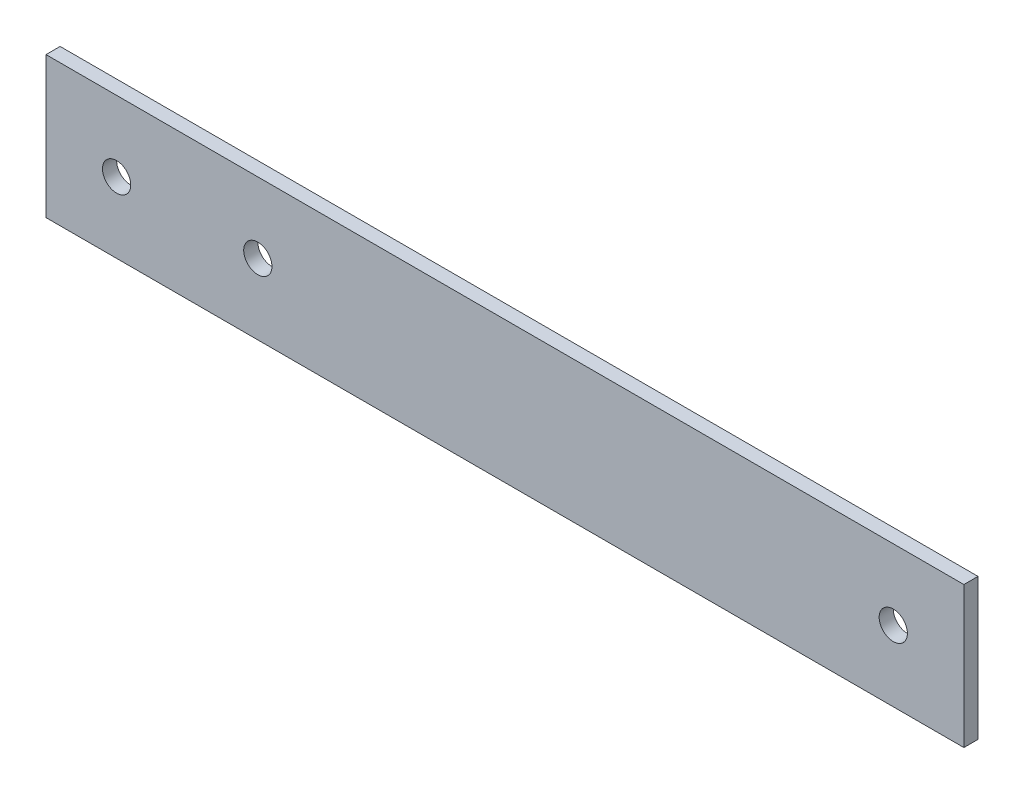
ISO-10303-21;
HEADER;
FILE_DESCRIPTION(('STEP AP214'),'2;1');
FILE_NAME('part.step','',(''),(''),'','','');
FILE_SCHEMA(('AUTOMOTIVE_DESIGN { 1 0 10303 214 1 1 1 1 }'));
ENDSEC;
DATA;
#1=APPLICATION_CONTEXT('core data for automotive mechanical design processes');
#2=APPLICATION_PROTOCOL_DEFINITION('international standard','automotive_design',2000,#1);
#3=PRODUCT_CONTEXT('',#1,'mechanical');
#4=PRODUCT('Part','Part','',(#3));
#5=PRODUCT_RELATED_PRODUCT_CATEGORY('part','',(#4));
#6=PRODUCT_DEFINITION_FORMATION('','',#4);
#7=PRODUCT_DEFINITION_CONTEXT('part definition',#1,'design');
#8=PRODUCT_DEFINITION('design','',#6,#7);
#9=PRODUCT_DEFINITION_SHAPE('','',#8);
#10=(LENGTH_UNIT() NAMED_UNIT(*) SI_UNIT(.MILLI.,.METRE.));
#11=(NAMED_UNIT(*) PLANE_ANGLE_UNIT() SI_UNIT($,.RADIAN.));
#12=(NAMED_UNIT(*) SI_UNIT($,.STERADIAN.) SOLID_ANGLE_UNIT());
#13=UNCERTAINTY_MEASURE_WITH_UNIT(LENGTH_MEASURE(1.E-05),#10,'distance_accuracy_value','');
#14=(GEOMETRIC_REPRESENTATION_CONTEXT(3) GLOBAL_UNCERTAINTY_ASSIGNED_CONTEXT((#13)) GLOBAL_UNIT_ASSIGNED_CONTEXT((#10,
#11,#12)) REPRESENTATION_CONTEXT('',''));
#15=CARTESIAN_POINT('',(0.,0.,0.));
#16=DIRECTION('',(0.,0.,1.));
#17=DIRECTION('',(1.,0.,0.));
#18=AXIS2_PLACEMENT_3D('',#15,#16,#17);
#19=CARTESIAN_POINT('',(65.,10.,2.));
#20=DIRECTION('',(-1.,0.,0.));
#21=DIRECTION('',(0.,-1.,0.));
#22=AXIS2_PLACEMENT_3D('',#19,#20,#21);
#23=PLANE('',#22);
#24=DIRECTION('',(0.,1.,0.));
#25=VECTOR('',#24,1.);
#26=CARTESIAN_POINT('',(65.,10.,0.));
#27=LINE('',#26,#25);
#28=CARTESIAN_POINT('',(65.,-10.,0.));
#29=VERTEX_POINT('',#28);
#30=CARTESIAN_POINT('',(65.,10.,0.));
#31=VERTEX_POINT('',#30);
#32=EDGE_CURVE('E99',#29,#31,#27,.T.);
#33=ORIENTED_EDGE('',*,*,#32,.T.);
#34=DIRECTION('',(0.,0.,-1.));
#35=VECTOR('',#34,1.);
#36=CARTESIAN_POINT('',(65.,10.,2.));
#37=LINE('',#36,#35);
#38=CARTESIAN_POINT('',(65.,10.,2.));
#39=VERTEX_POINT('',#38);
#40=EDGE_CURVE('E11',#39,#31,#37,.T.);
#41=ORIENTED_EDGE('',*,*,#40,.F.);
#42=DIRECTION('',(0.,1.,0.));
#43=VECTOR('',#42,1.);
#44=CARTESIAN_POINT('',(65.,10.,2.));
#45=LINE('',#44,#43);
#46=CARTESIAN_POINT('',(65.,-10.,2.));
#47=VERTEX_POINT('',#46);
#48=EDGE_CURVE('E87',#47,#39,#45,.T.);
#49=ORIENTED_EDGE('',*,*,#48,.F.);
#50=DIRECTION('',(0.,0.,-1.));
#51=VECTOR('',#50,1.);
#52=CARTESIAN_POINT('',(65.,-10.,2.));
#53=LINE('',#52,#51);
#54=EDGE_CURVE('E95',#47,#29,#53,.T.);
#55=ORIENTED_EDGE('',*,*,#54,.T.);
#56=EDGE_LOOP('',(#33,#41,#49,#55));
#57=FACE_BOUND('',#56,.T.);
#58=ADVANCED_FACE('F36',(#57),#23,.F.);
#59=CARTESIAN_POINT('',(-65.,10.,2.));
#60=DIRECTION('',(0.,-1.,0.));
#61=DIRECTION('',(0.,0.,-1.));
#62=AXIS2_PLACEMENT_3D('',#59,#60,#61);
#63=PLANE('',#62);
#64=DIRECTION('',(-1.,0.,0.));
#65=VECTOR('',#64,1.);
#66=CARTESIAN_POINT('',(-65.,10.,0.));
#67=LINE('',#66,#65);
#68=CARTESIAN_POINT('',(-65.,10.,0.));
#69=VERTEX_POINT('',#68);
#70=EDGE_CURVE('E91',#31,#69,#67,.T.);
#71=ORIENTED_EDGE('',*,*,#70,.T.);
#72=DIRECTION('',(0.,0.,-1.));
#73=VECTOR('',#72,1.);
#74=CARTESIAN_POINT('',(-65.,10.,2.));
#75=LINE('',#74,#73);
#76=CARTESIAN_POINT('',(-65.,10.,2.));
#77=VERTEX_POINT('',#76);
#78=EDGE_CURVE('E44',#77,#69,#75,.T.);
#79=ORIENTED_EDGE('',*,*,#78,.F.);
#80=DIRECTION('',(-1.,0.,0.));
#81=VECTOR('',#80,1.);
#82=CARTESIAN_POINT('',(-65.,10.,2.));
#83=LINE('',#82,#81);
#84=EDGE_CURVE('E82',#39,#77,#83,.T.);
#85=ORIENTED_EDGE('',*,*,#84,.F.);
#86=ORIENTED_EDGE('',*,*,#40,.T.);
#87=EDGE_LOOP('',(#71,#79,#85,#86));
#88=FACE_BOUND('',#87,.T.);
#89=ADVANCED_FACE('F90',(#88),#63,.F.);
#90=CARTESIAN_POINT('',(-65.,10.,2.));
#91=DIRECTION('',(1.,0.,0.));
#92=DIRECTION('',(0.,1.,0.));
#93=AXIS2_PLACEMENT_3D('',#90,#91,#92);
#94=PLANE('',#93);
#95=DIRECTION('',(0.,-1.,0.));
#96=VECTOR('',#95,1.);
#97=CARTESIAN_POINT('',(-65.,10.,0.));
#98=LINE('',#97,#96);
#99=CARTESIAN_POINT('',(-65.,-10.,0.));
#100=VERTEX_POINT('',#99);
#101=EDGE_CURVE('E69',#69,#100,#98,.T.);
#102=ORIENTED_EDGE('',*,*,#101,.T.);
#103=DIRECTION('',(0.,0.,-1.));
#104=VECTOR('',#103,1.);
#105=CARTESIAN_POINT('',(-65.,-10.,2.));
#106=LINE('',#105,#104);
#107=CARTESIAN_POINT('',(-65.,-10.,2.));
#108=VERTEX_POINT('',#107);
#109=EDGE_CURVE('E92',#108,#100,#106,.T.);
#110=ORIENTED_EDGE('',*,*,#109,.F.);
#111=DIRECTION('',(0.,-1.,0.));
#112=VECTOR('',#111,1.);
#113=CARTESIAN_POINT('',(-65.,10.,2.));
#114=LINE('',#113,#112);
#115=EDGE_CURVE('E85',#77,#108,#114,.T.);
#116=ORIENTED_EDGE('',*,*,#115,.F.);
#117=ORIENTED_EDGE('',*,*,#78,.T.);
#118=EDGE_LOOP('',(#102,#110,#116,#117));
#119=FACE_BOUND('',#118,.T.);
#120=ADVANCED_FACE('F93',(#119),#94,.F.);
#121=CARTESIAN_POINT('',(-65.,-10.,2.));
#122=DIRECTION('',(0.,1.,0.));
#123=DIRECTION('',(0.,0.,1.));
#124=AXIS2_PLACEMENT_3D('',#121,#122,#123);
#125=PLANE('',#124);
#126=DIRECTION('',(1.,0.,0.));
#127=VECTOR('',#126,1.);
#128=CARTESIAN_POINT('',(-65.,-10.,0.));
#129=LINE('',#128,#127);
#130=EDGE_CURVE('E75',#100,#29,#129,.T.);
#131=ORIENTED_EDGE('',*,*,#130,.T.);
#132=ORIENTED_EDGE('',*,*,#54,.F.);
#133=DIRECTION('',(1.,0.,0.));
#134=VECTOR('',#133,1.);
#135=CARTESIAN_POINT('',(-65.,-10.,2.));
#136=LINE('',#135,#134);
#137=EDGE_CURVE('E52',#108,#47,#136,.T.);
#138=ORIENTED_EDGE('',*,*,#137,.F.);
#139=ORIENTED_EDGE('',*,*,#109,.T.);
#140=EDGE_LOOP('',(#131,#132,#138,#139));
#141=FACE_BOUND('',#140,.T.);
#142=ADVANCED_FACE('F107',(#141),#125,.F.);
#143=CARTESIAN_POINT('',(0.,0.,2.));
#144=DIRECTION('',(0.,0.,1.));
#145=DIRECTION('',(1.,0.,0.));
#146=AXIS2_PLACEMENT_3D('',#143,#144,#145);
#147=PLANE('',#146);
#148=CARTESIAN_POINT('',(-35.,0.,2.));
#149=DIRECTION('',(0.,0.,1.));
#150=DIRECTION('',(1.,0.,0.));
#151=AXIS2_PLACEMENT_3D('',#148,#149,#150);
#152=CIRCLE('',#151,2.);
#153=CARTESIAN_POINT('',(-33.,0.,2.));
#154=VERTEX_POINT('',#153);
#155=EDGE_CURVE('E125',#154,#154,#152,.T.);
#156=ORIENTED_EDGE('',*,*,#155,.F.);
#157=EDGE_LOOP('',(#156));
#158=FACE_BOUND('',#157,.T.);
#159=CARTESIAN_POINT('',(-55.,0.,2.));
#160=DIRECTION('',(0.,0.,1.));
#161=DIRECTION('',(1.,0.,0.));
#162=AXIS2_PLACEMENT_3D('',#159,#160,#161);
#163=CIRCLE('',#162,2.);
#164=CARTESIAN_POINT('',(-53.,0.,2.));
#165=VERTEX_POINT('',#164);
#166=EDGE_CURVE('E120',#165,#165,#163,.T.);
#167=ORIENTED_EDGE('',*,*,#166,.F.);
#168=EDGE_LOOP('',(#167));
#169=FACE_BOUND('',#168,.T.);
#170=CARTESIAN_POINT('',(55.,0.,2.));
#171=DIRECTION('',(0.,0.,1.));
#172=DIRECTION('',(1.,0.,0.));
#173=AXIS2_PLACEMENT_3D('',#170,#171,#172);
#174=CIRCLE('',#173,2.);
#175=CARTESIAN_POINT('',(57.,0.,2.));
#176=VERTEX_POINT('',#175);
#177=EDGE_CURVE('E113',#176,#176,#174,.T.);
#178=ORIENTED_EDGE('',*,*,#177,.F.);
#179=EDGE_LOOP('',(#178));
#180=FACE_BOUND('',#179,.T.);
#181=ORIENTED_EDGE('',*,*,#48,.T.);
#182=ORIENTED_EDGE('',*,*,#84,.T.);
#183=ORIENTED_EDGE('',*,*,#115,.T.);
#184=ORIENTED_EDGE('',*,*,#137,.T.);
#185=EDGE_LOOP('',(#181,#182,#183,#184));
#186=FACE_BOUND('',#185,.T.);
#187=ADVANCED_FACE('F83',(#158,#169,#180,#186),#147,.T.);
#188=CARTESIAN_POINT('',(0.,0.,0.));
#189=DIRECTION('',(0.,0.,1.));
#190=DIRECTION('',(1.,0.,0.));
#191=AXIS2_PLACEMENT_3D('',#188,#189,#190);
#192=PLANE('',#191);
#193=CARTESIAN_POINT('',(-35.,0.,0.));
#194=DIRECTION('',(0.,0.,1.));
#195=DIRECTION('',(1.,0.,0.));
#196=AXIS2_PLACEMENT_3D('',#193,#194,#195);
#197=CIRCLE('',#196,2.);
#198=CARTESIAN_POINT('',(-33.,0.,0.));
#199=VERTEX_POINT('',#198);
#200=EDGE_CURVE('E117',#199,#199,#197,.T.);
#201=ORIENTED_EDGE('',*,*,#200,.T.);
#202=EDGE_LOOP('',(#201));
#203=FACE_BOUND('',#202,.T.);
#204=CARTESIAN_POINT('',(-55.,0.,0.));
#205=DIRECTION('',(0.,0.,1.));
#206=DIRECTION('',(1.,0.,0.));
#207=AXIS2_PLACEMENT_3D('',#204,#205,#206);
#208=CIRCLE('',#207,2.);
#209=CARTESIAN_POINT('',(-53.,0.,0.));
#210=VERTEX_POINT('',#209);
#211=EDGE_CURVE('E102',#210,#210,#208,.T.);
#212=ORIENTED_EDGE('',*,*,#211,.T.);
#213=EDGE_LOOP('',(#212));
#214=FACE_BOUND('',#213,.T.);
#215=CARTESIAN_POINT('',(55.,0.,0.));
#216=DIRECTION('',(0.,0.,1.));
#217=DIRECTION('',(1.,0.,0.));
#218=AXIS2_PLACEMENT_3D('',#215,#216,#217);
#219=CIRCLE('',#218,2.);
#220=CARTESIAN_POINT('',(57.,0.,0.));
#221=VERTEX_POINT('',#220);
#222=EDGE_CURVE('E116',#221,#221,#219,.T.);
#223=ORIENTED_EDGE('',*,*,#222,.T.);
#224=EDGE_LOOP('',(#223));
#225=FACE_BOUND('',#224,.T.);
#226=ORIENTED_EDGE('',*,*,#32,.F.);
#227=ORIENTED_EDGE('',*,*,#130,.F.);
#228=ORIENTED_EDGE('',*,*,#101,.F.);
#229=ORIENTED_EDGE('',*,*,#70,.F.);
#230=EDGE_LOOP('',(#226,#227,#228,#229));
#231=FACE_BOUND('',#230,.T.);
#232=ADVANCED_FACE('F110',(#203,#214,#225,#231),#192,.F.);
#233=CARTESIAN_POINT('',(55.,0.,0.));
#234=DIRECTION('',(0.,0.,1.));
#235=DIRECTION('',(1.,0.,0.));
#236=AXIS2_PLACEMENT_3D('',#233,#234,#235);
#237=CYLINDRICAL_SURFACE('',#236,2.);
#238=ORIENTED_EDGE('',*,*,#222,.F.);
#239=EDGE_LOOP('',(#238));
#240=FACE_BOUND('',#239,.T.);
#241=ORIENTED_EDGE('',*,*,#177,.T.);
#242=EDGE_LOOP('',(#241));
#243=FACE_BOUND('',#242,.T.);
#244=ADVANCED_FACE('F147',(#240,#243),#237,.F.);
#245=CARTESIAN_POINT('',(-55.,0.,0.));
#246=DIRECTION('',(0.,0.,1.));
#247=DIRECTION('',(1.,0.,0.));
#248=AXIS2_PLACEMENT_3D('',#245,#246,#247);
#249=CYLINDRICAL_SURFACE('',#248,2.);
#250=ORIENTED_EDGE('',*,*,#211,.F.);
#251=EDGE_LOOP('',(#250));
#252=FACE_BOUND('',#251,.T.);
#253=ORIENTED_EDGE('',*,*,#166,.T.);
#254=EDGE_LOOP('',(#253));
#255=FACE_BOUND('',#254,.T.);
#256=ADVANCED_FACE('F136',(#252,#255),#249,.F.);
#257=CARTESIAN_POINT('',(-35.,0.,0.));
#258=DIRECTION('',(0.,0.,1.));
#259=DIRECTION('',(1.,0.,0.));
#260=AXIS2_PLACEMENT_3D('',#257,#258,#259);
#261=CYLINDRICAL_SURFACE('',#260,2.);
#262=ORIENTED_EDGE('',*,*,#200,.F.);
#263=EDGE_LOOP('',(#262));
#264=FACE_BOUND('',#263,.T.);
#265=ORIENTED_EDGE('',*,*,#155,.T.);
#266=EDGE_LOOP('',(#265));
#267=FACE_BOUND('',#266,.T.);
#268=ADVANCED_FACE('F133',(#264,#267),#261,.F.);
#269=CLOSED_SHELL('',(#58,#89,#120,#142,#187,#232,#244,#256,#268));
#270=MANIFOLD_SOLID_BREP('B2',#269);
#271=ADVANCED_BREP_SHAPE_REPRESENTATION('',(#18,#270),#14);
#272=SHAPE_DEFINITION_REPRESENTATION(#9,#271);
ENDSEC;
END-ISO-10303-21;
